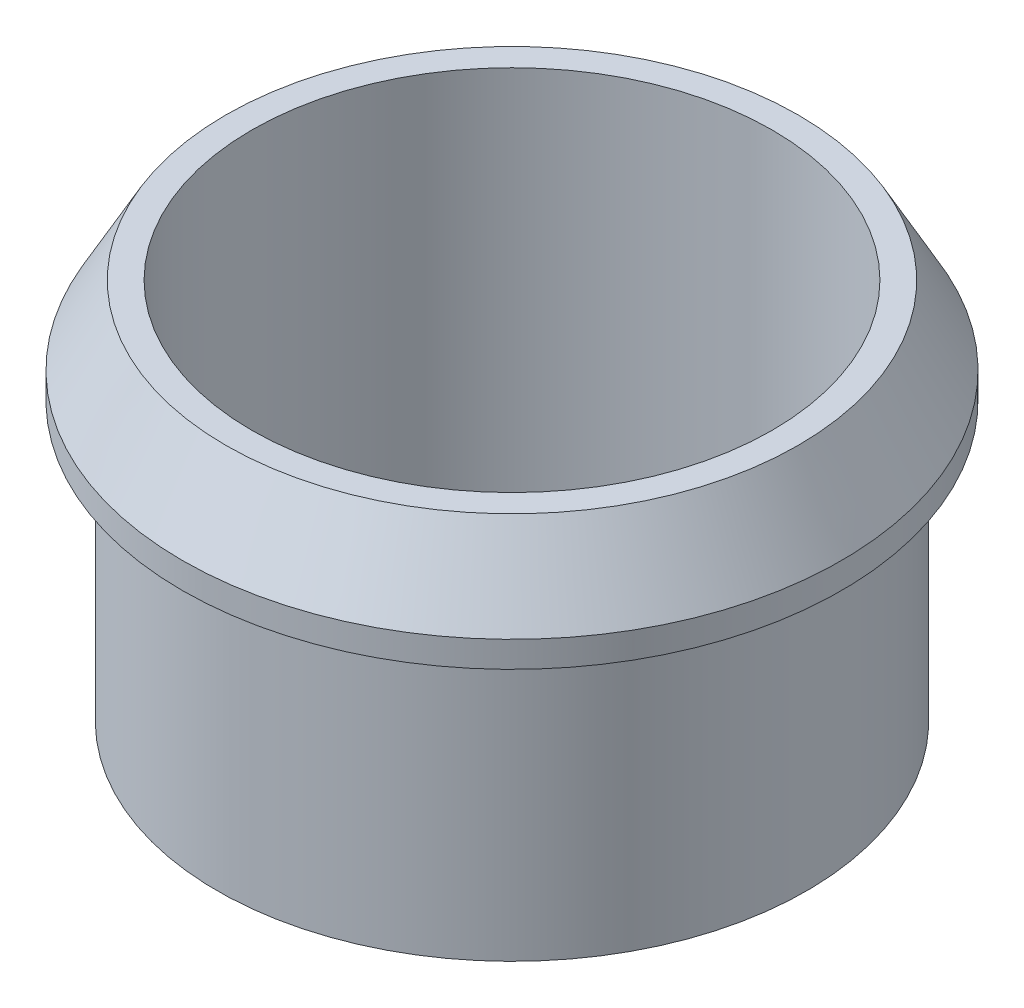
ISO-10303-21;
HEADER;
FILE_DESCRIPTION(('STEP AP214'),'2;1');
FILE_NAME('part.step','',(''),(''),'','','');
FILE_SCHEMA(('AUTOMOTIVE_DESIGN { 1 0 10303 214 1 1 1 1 }'));
ENDSEC;
DATA;
#1=APPLICATION_CONTEXT('core data for automotive mechanical design processes');
#2=APPLICATION_PROTOCOL_DEFINITION('international standard','automotive_design',2000,#1);
#3=PRODUCT_CONTEXT('',#1,'mechanical');
#4=PRODUCT('Part','Part','',(#3));
#5=PRODUCT_RELATED_PRODUCT_CATEGORY('part','',(#4));
#6=PRODUCT_DEFINITION_FORMATION('','',#4);
#7=PRODUCT_DEFINITION_CONTEXT('part definition',#1,'design');
#8=PRODUCT_DEFINITION('design','',#6,#7);
#9=PRODUCT_DEFINITION_SHAPE('','',#8);
#10=(LENGTH_UNIT() NAMED_UNIT(*) SI_UNIT(.MILLI.,.METRE.));
#11=(NAMED_UNIT(*) PLANE_ANGLE_UNIT() SI_UNIT($,.RADIAN.));
#12=(NAMED_UNIT(*) SI_UNIT($,.STERADIAN.) SOLID_ANGLE_UNIT());
#13=UNCERTAINTY_MEASURE_WITH_UNIT(LENGTH_MEASURE(1.E-05),#10,'distance_accuracy_value','');
#14=(GEOMETRIC_REPRESENTATION_CONTEXT(3) GLOBAL_UNCERTAINTY_ASSIGNED_CONTEXT((#13)) GLOBAL_UNIT_ASSIGNED_CONTEXT((#10,
#11,#12)) REPRESENTATION_CONTEXT('',''));
#15=CARTESIAN_POINT('',(0.,0.,0.));
#16=DIRECTION('',(0.,0.,1.));
#17=DIRECTION('',(1.,0.,0.));
#18=AXIS2_PLACEMENT_3D('',#15,#16,#17);
#19=CARTESIAN_POINT('',(8.495,0.,0.));
#20=DIRECTION('',(0.,-1.,0.));
#21=DIRECTION('',(0.,0.,-1.));
#22=AXIS2_PLACEMENT_3D('',#19,#20,#21);
#23=PLANE('',#22);
#24=CARTESIAN_POINT('',(0.,0.,0.));
#25=DIRECTION('',(0.,-1.,0.));
#26=DIRECTION('',(0.,0.,-1.));
#27=AXIS2_PLACEMENT_3D('',#24,#25,#26);
#28=CIRCLE('',#27,8.495);
#29=CARTESIAN_POINT('',(0.,0.,-8.495));
#30=VERTEX_POINT('',#29);
#31=EDGE_CURVE('E68',#30,#30,#28,.T.);
#32=ORIENTED_EDGE('',*,*,#31,.T.);
#33=EDGE_LOOP('',(#32));
#34=FACE_BOUND('',#33,.T.);
#35=CARTESIAN_POINT('',(0.,0.,0.));
#36=DIRECTION('',(0.,-1.,0.));
#37=DIRECTION('',(0.,0.,-1.));
#38=AXIS2_PLACEMENT_3D('',#35,#36,#37);
#39=CIRCLE('',#38,7.5);
#40=CARTESIAN_POINT('',(0.,0.,-7.5));
#41=VERTEX_POINT('',#40);
#42=EDGE_CURVE('E10',#41,#41,#39,.T.);
#43=ORIENTED_EDGE('',*,*,#42,.F.);
#44=EDGE_LOOP('',(#43));
#45=FACE_BOUND('',#44,.T.);
#46=ADVANCED_FACE('F43',(#34,#45),#23,.T.);
#47=CARTESIAN_POINT('',(0.,0.,0.));
#48=DIRECTION('',(0.,-1.,0.));
#49=DIRECTION('',(0.,0.,-1.));
#50=AXIS2_PLACEMENT_3D('',#47,#48,#49);
#51=CYLINDRICAL_SURFACE('',#50,7.5);
#52=ORIENTED_EDGE('',*,*,#42,.T.);
#53=EDGE_LOOP('',(#52));
#54=FACE_BOUND('',#53,.T.);
#55=CARTESIAN_POINT('',(0.,11.,0.));
#56=DIRECTION('',(0.,-1.,0.));
#57=DIRECTION('',(0.,0.,-1.));
#58=AXIS2_PLACEMENT_3D('',#55,#56,#57);
#59=CIRCLE('',#58,7.5);
#60=CARTESIAN_POINT('',(0.,11.,-7.5));
#61=VERTEX_POINT('',#60);
#62=EDGE_CURVE('E49',#61,#61,#59,.T.);
#63=ORIENTED_EDGE('',*,*,#62,.F.);
#64=EDGE_LOOP('',(#63));
#65=FACE_BOUND('',#64,.T.);
#66=ADVANCED_FACE('F86',(#54,#65),#51,.F.);
#67=CARTESIAN_POINT('',(7.5,11.,0.));
#68=DIRECTION('',(0.,1.,0.));
#69=DIRECTION('',(0.,0.,1.));
#70=AXIS2_PLACEMENT_3D('',#67,#68,#69);
#71=PLANE('',#70);
#72=ORIENTED_EDGE('',*,*,#62,.T.);
#73=EDGE_LOOP('',(#72));
#74=FACE_BOUND('',#73,.T.);
#75=CARTESIAN_POINT('',(0.,11.,0.));
#76=DIRECTION('',(0.,-1.,0.));
#77=DIRECTION('',(0.,0.,-1.));
#78=AXIS2_PLACEMENT_3D('',#75,#76,#77);
#79=CIRCLE('',#78,8.25);
#80=CARTESIAN_POINT('',(0.,11.,-8.25));
#81=VERTEX_POINT('',#80);
#82=EDGE_CURVE('E53',#81,#81,#79,.T.);
#83=ORIENTED_EDGE('',*,*,#82,.F.);
#84=EDGE_LOOP('',(#83));
#85=FACE_BOUND('',#84,.T.);
#86=ADVANCED_FACE('F90',(#74,#85),#71,.T.);
#87=CARTESIAN_POINT('',(0.,8.75,0.));
#88=DIRECTION('',(0.,-1.,0.));
#89=DIRECTION('',(0.,0.,-1.));
#90=AXIS2_PLACEMENT_3D('',#87,#88,#89);
#91=CONICAL_SURFACE('',#90,9.5,0.507098504392337);
#92=ORIENTED_EDGE('',*,*,#82,.T.);
#93=EDGE_LOOP('',(#92));
#94=FACE_BOUND('',#93,.T.);
#95=CARTESIAN_POINT('',(0.,8.75,0.));
#96=DIRECTION('',(0.,-1.,0.));
#97=DIRECTION('',(0.,0.,-1.));
#98=AXIS2_PLACEMENT_3D('',#95,#96,#97);
#99=CIRCLE('',#98,9.5);
#100=CARTESIAN_POINT('',(0.,8.75,-9.5));
#101=VERTEX_POINT('',#100);
#102=EDGE_CURVE('E57',#101,#101,#99,.T.);
#103=ORIENTED_EDGE('',*,*,#102,.F.);
#104=EDGE_LOOP('',(#103));
#105=FACE_BOUND('',#104,.T.);
#106=ADVANCED_FACE('F94',(#94,#105),#91,.T.);
#107=CARTESIAN_POINT('',(0.,0.,0.));
#108=DIRECTION('',(0.,-1.,0.));
#109=DIRECTION('',(0.,0.,-1.));
#110=AXIS2_PLACEMENT_3D('',#107,#108,#109);
#111=CYLINDRICAL_SURFACE('',#110,9.5);
#112=ORIENTED_EDGE('',*,*,#102,.T.);
#113=EDGE_LOOP('',(#112));
#114=FACE_BOUND('',#113,.T.);
#115=CARTESIAN_POINT('',(0.,8.,0.));
#116=DIRECTION('',(0.,-1.,0.));
#117=DIRECTION('',(0.,0.,-1.));
#118=AXIS2_PLACEMENT_3D('',#115,#116,#117);
#119=CIRCLE('',#118,9.5);
#120=CARTESIAN_POINT('',(0.,8.,-9.5));
#121=VERTEX_POINT('',#120);
#122=EDGE_CURVE('E62',#121,#121,#119,.T.);
#123=ORIENTED_EDGE('',*,*,#122,.F.);
#124=EDGE_LOOP('',(#123));
#125=FACE_BOUND('',#124,.T.);
#126=ADVANCED_FACE('F82',(#114,#125),#111,.T.);
#127=CARTESIAN_POINT('',(9.5,8.,0.));
#128=DIRECTION('',(0.,-1.,0.));
#129=DIRECTION('',(0.,0.,-1.));
#130=AXIS2_PLACEMENT_3D('',#127,#128,#129);
#131=PLANE('',#130);
#132=ORIENTED_EDGE('',*,*,#122,.T.);
#133=EDGE_LOOP('',(#132));
#134=FACE_BOUND('',#133,.T.);
#135=CARTESIAN_POINT('',(0.,8.,0.));
#136=DIRECTION('',(0.,-1.,0.));
#137=DIRECTION('',(0.,0.,-1.));
#138=AXIS2_PLACEMENT_3D('',#135,#136,#137);
#139=CIRCLE('',#138,8.495);
#140=CARTESIAN_POINT('',(0.,8.,-8.495));
#141=VERTEX_POINT('',#140);
#142=EDGE_CURVE('E65',#141,#141,#139,.T.);
#143=ORIENTED_EDGE('',*,*,#142,.F.);
#144=EDGE_LOOP('',(#143));
#145=FACE_BOUND('',#144,.T.);
#146=ADVANCED_FACE('F76',(#134,#145),#131,.T.);
#147=CARTESIAN_POINT('',(0.,0.,0.));
#148=DIRECTION('',(0.,-1.,0.));
#149=DIRECTION('',(0.,0.,-1.));
#150=AXIS2_PLACEMENT_3D('',#147,#148,#149);
#151=CYLINDRICAL_SURFACE('',#150,8.495);
#152=ORIENTED_EDGE('',*,*,#142,.T.);
#153=EDGE_LOOP('',(#152));
#154=FACE_BOUND('',#153,.T.);
#155=ORIENTED_EDGE('',*,*,#31,.F.);
#156=EDGE_LOOP('',(#155));
#157=FACE_BOUND('',#156,.T.);
#158=ADVANCED_FACE('F74',(#154,#157),#151,.T.);
#159=CLOSED_SHELL('',(#46,#66,#86,#106,#126,#146,#158));
#160=MANIFOLD_SOLID_BREP('B2',#159);
#161=ADVANCED_BREP_SHAPE_REPRESENTATION('',(#18,#160),#14);
#162=SHAPE_DEFINITION_REPRESENTATION(#9,#161);
ENDSEC;
END-ISO-10303-21;
